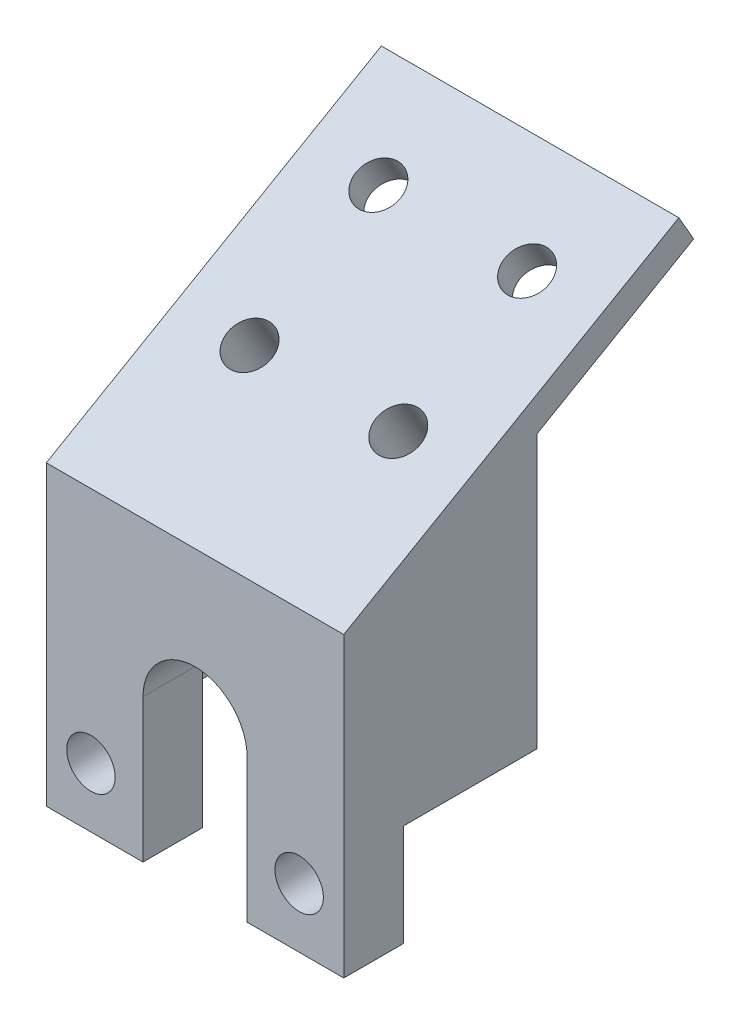
ISO-10303-21;
HEADER;
FILE_DESCRIPTION(('STEP AP214'),'2;1');
FILE_NAME('part.step','',(''),(''),'','','');
FILE_SCHEMA(('AUTOMOTIVE_DESIGN { 1 0 10303 214 1 1 1 1 }'));
ENDSEC;
DATA;
#1=APPLICATION_CONTEXT('core data for automotive mechanical design processes');
#2=APPLICATION_PROTOCOL_DEFINITION('international standard','automotive_design',2000,#1);
#3=PRODUCT_CONTEXT('',#1,'mechanical');
#4=PRODUCT('Part','Part','',(#3));
#5=PRODUCT_RELATED_PRODUCT_CATEGORY('part','',(#4));
#6=PRODUCT_DEFINITION_FORMATION('','',#4);
#7=PRODUCT_DEFINITION_CONTEXT('part definition',#1,'design');
#8=PRODUCT_DEFINITION('design','',#6,#7);
#9=PRODUCT_DEFINITION_SHAPE('','',#8);
#10=(LENGTH_UNIT() NAMED_UNIT(*) SI_UNIT(.MILLI.,.METRE.));
#11=(NAMED_UNIT(*) PLANE_ANGLE_UNIT() SI_UNIT($,.RADIAN.));
#12=(NAMED_UNIT(*) SI_UNIT($,.STERADIAN.) SOLID_ANGLE_UNIT());
#13=UNCERTAINTY_MEASURE_WITH_UNIT(LENGTH_MEASURE(1.E-05),#10,'distance_accuracy_value','');
#14=(GEOMETRIC_REPRESENTATION_CONTEXT(3) GLOBAL_UNCERTAINTY_ASSIGNED_CONTEXT((#13)) GLOBAL_UNIT_ASSIGNED_CONTEXT((#10,
#11,#12)) REPRESENTATION_CONTEXT('',''));
#15=CARTESIAN_POINT('',(0.,0.,0.));
#16=DIRECTION('',(0.,0.,1.));
#17=DIRECTION('',(1.,0.,0.));
#18=AXIS2_PLACEMENT_3D('',#15,#16,#17);
#19=CARTESIAN_POINT('',(-89.0344821648403,43.9136285796139,-9.));
#20=DIRECTION('',(0.,0.,1.));
#21=DIRECTION('',(1.,0.,0.));
#22=AXIS2_PLACEMENT_3D('',#19,#20,#21);
#23=PLANE('',#22);
#24=CARTESIAN_POINT('',(-81.0344821648403,43.1319750978219,-9.));
#25=DIRECTION('',(0.,0.,-1.));
#26=DIRECTION('',(-1.,0.,0.));
#27=AXIS2_PLACEMENT_3D('',#24,#25,#26);
#28=CIRCLE('',#27,0.999999999999998);
#29=CARTESIAN_POINT('',(-82.0344821648403,43.1319750978219,-9.));
#30=VERTEX_POINT('',#29);
#31=EDGE_CURVE('E163',#30,#30,#28,.T.);
#32=ORIENTED_EDGE('',*,*,#31,.F.);
#33=EDGE_LOOP('',(#32));
#34=FACE_BOUND('',#33,.T.);
#35=CARTESIAN_POINT('',(-96.5344821648403,51.7856142064587,-9.));
#36=DIRECTION('',(0.,0.,-1.));
#37=DIRECTION('',(-1.,0.,0.));
#38=AXIS2_PLACEMENT_3D('',#35,#36,#37);
#39=CIRCLE('',#38,0.999999999999998);
#40=CARTESIAN_POINT('',(-97.5344821648403,51.7856142064587,-9.));
#41=VERTEX_POINT('',#40);
#42=EDGE_CURVE('E169',#41,#41,#39,.T.);
#43=ORIENTED_EDGE('',*,*,#42,.F.);
#44=EDGE_LOOP('',(#43));
#45=FACE_BOUND('',#44,.T.);
#46=DIRECTION('',(-1.,0.,0.));
#47=VECTOR('',#46,1.);
#48=CARTESIAN_POINT('',(-79.0344821648403,59.4817666291652,-9.));
#49=LINE('',#48,#47);
#50=CARTESIAN_POINT('',(-79.0344821648403,59.4817666291652,-9.));
#51=VERTEX_POINT('',#50);
#52=CARTESIAN_POINT('',(-99.0344821648403,59.4817666291652,-9.));
#53=VERTEX_POINT('',#52);
#54=EDGE_CURVE('E152',#51,#53,#49,.T.);
#55=ORIENTED_EDGE('',*,*,#54,.F.);
#56=DIRECTION('',(0.,-1.,0.));
#57=VECTOR('',#56,1.);
#58=CARTESIAN_POINT('',(-79.0344821648403,41.1319750978219,-9.));
#59=LINE('',#58,#57);
#60=CARTESIAN_POINT('',(-79.0344821648403,41.1319750978219,-9.));
#61=VERTEX_POINT('',#60);
#62=EDGE_CURVE('E177',#51,#61,#59,.T.);
#63=ORIENTED_EDGE('',*,*,#62,.T.);
#64=DIRECTION('',(-1.,0.,0.));
#65=VECTOR('',#64,1.);
#66=CARTESIAN_POINT('',(-79.0344821648403,41.1319750978219,-9.));
#67=LINE('',#66,#65);
#68=CARTESIAN_POINT('',(-83.7182425250917,41.1319750978219,-9.));
#69=VERTEX_POINT('',#68);
#70=EDGE_CURVE('E179',#61,#69,#67,.T.);
#71=ORIENTED_EDGE('',*,*,#70,.T.);
#72=CARTESIAN_POINT('',(-89.0344821648403,43.9136285796139,-9.));
#73=DIRECTION('',(0.,0.,1.));
#74=DIRECTION('',(1.,0.,0.));
#75=AXIS2_PLACEMENT_3D('',#72,#73,#74);
#76=CIRCLE('',#75,6.);
#77=CARTESIAN_POINT('',(-94.3507218045889,41.1319750978219,-9.));
#78=VERTEX_POINT('',#77);
#79=EDGE_CURVE('E182',#69,#78,#76,.T.);
#80=ORIENTED_EDGE('',*,*,#79,.T.);
#81=DIRECTION('',(-1.,0.,0.));
#82=VECTOR('',#81,1.);
#83=CARTESIAN_POINT('',(-94.3507218045889,41.1319750978219,-9.));
#84=LINE('',#83,#82);
#85=CARTESIAN_POINT('',(-99.0344821648403,41.1319750978219,-9.));
#86=VERTEX_POINT('',#85);
#87=EDGE_CURVE('E184',#78,#86,#84,.T.);
#88=ORIENTED_EDGE('',*,*,#87,.T.);
#89=DIRECTION('',(0.,1.,0.));
#90=VECTOR('',#89,1.);
#91=CARTESIAN_POINT('',(-99.0344821648403,54.2856142064587,-9.));
#92=LINE('',#91,#90);
#93=EDGE_CURVE('E186',#86,#53,#92,.T.);
#94=ORIENTED_EDGE('',*,*,#93,.T.);
#95=EDGE_LOOP('',(#55,#63,#71,#80,#88,#94));
#96=FACE_BOUND('',#95,.T.);
#97=ADVANCED_FACE('F33',(#34,#45,#96),#23,.F.);
#98=CARTESIAN_POINT('',(-89.0344821648403,43.9136285796139,0.));
#99=DIRECTION('',(0.,0.,1.));
#100=DIRECTION('',(1.,0.,0.));
#101=AXIS2_PLACEMENT_3D('',#98,#99,#100);
#102=PLANE('',#101);
#103=CARTESIAN_POINT('',(-82.0344821648403,38.2856142064587,0.));
#104=DIRECTION('',(0.,0.,1.));
#105=DIRECTION('',(1.,0.,0.));
#106=AXIS2_PLACEMENT_3D('',#103,#104,#105);
#107=CIRCLE('',#106,1.62801437315523);
#108=CARTESIAN_POINT('',(-80.4064677916851,38.2856142064587,0.));
#109=VERTEX_POINT('',#108);
#110=EDGE_CURVE('E207',#109,#109,#107,.T.);
#111=ORIENTED_EDGE('',*,*,#110,.T.);
#112=EDGE_LOOP('',(#111));
#113=FACE_BOUND('',#112,.T.);
#114=CARTESIAN_POINT('',(-96.0344821648403,38.2856142064587,0.));
#115=DIRECTION('',(0.,0.,1.));
#116=DIRECTION('',(1.,0.,0.));
#117=AXIS2_PLACEMENT_3D('',#114,#115,#116);
#118=CIRCLE('',#117,1.62801437315523);
#119=CARTESIAN_POINT('',(-94.4064677916851,38.2856142064587,0.));
#120=VERTEX_POINT('',#119);
#121=EDGE_CURVE('E211',#120,#120,#118,.T.);
#122=ORIENTED_EDGE('',*,*,#121,.T.);
#123=EDGE_LOOP('',(#122));
#124=FACE_BOUND('',#123,.T.);
#125=DIRECTION('',(-1.,0.,0.));
#126=VECTOR('',#125,1.);
#127=CARTESIAN_POINT('',(-94.3507218045889,41.1319750978219,0.));
#128=LINE('',#127,#126);
#129=CARTESIAN_POINT('',(-94.3507218045889,41.1319750978219,0.));
#130=VERTEX_POINT('',#129);
#131=CARTESIAN_POINT('',(-99.0344821648403,41.1319750978219,0.));
#132=VERTEX_POINT('',#131);
#133=EDGE_CURVE('E180',#130,#132,#128,.T.);
#134=ORIENTED_EDGE('',*,*,#133,.F.);
#135=CARTESIAN_POINT('',(-89.0344821648403,43.9136285796139,0.));
#136=DIRECTION('',(0.,0.,1.));
#137=DIRECTION('',(1.,0.,0.));
#138=AXIS2_PLACEMENT_3D('',#135,#136,#137);
#139=CIRCLE('',#138,6.);
#140=CARTESIAN_POINT('',(-83.7182425250917,41.1319750978219,0.));
#141=VERTEX_POINT('',#140);
#142=EDGE_CURVE('E191',#141,#130,#139,.T.);
#143=ORIENTED_EDGE('',*,*,#142,.F.);
#144=DIRECTION('',(-1.,0.,0.));
#145=VECTOR('',#144,1.);
#146=CARTESIAN_POINT('',(-79.0344821648403,41.1319750978219,0.));
#147=LINE('',#146,#145);
#148=CARTESIAN_POINT('',(-79.0344821648403,41.1319750978219,0.));
#149=VERTEX_POINT('',#148);
#150=EDGE_CURVE('E168',#149,#141,#147,.T.);
#151=ORIENTED_EDGE('',*,*,#150,.F.);
#152=DIRECTION('',(0.,1.,0.));
#153=VECTOR('',#152,1.);
#154=CARTESIAN_POINT('',(-79.0344821648403,42.2856142064587,0.));
#155=LINE('',#154,#153);
#156=CARTESIAN_POINT('',(-79.0344821648403,34.2856142064587,0.));
#157=VERTEX_POINT('',#156);
#158=EDGE_CURVE('E223',#157,#149,#155,.T.);
#159=ORIENTED_EDGE('',*,*,#158,.F.);
#160=DIRECTION('',(1.,0.,0.));
#161=VECTOR('',#160,1.);
#162=CARTESIAN_POINT('',(-79.0344821648403,34.2856142064587,0.));
#163=LINE('',#162,#161);
#164=CARTESIAN_POINT('',(-85.5344821648403,34.2856142064587,0.));
#165=VERTEX_POINT('',#164);
#166=EDGE_CURVE('E249',#165,#157,#163,.T.);
#167=ORIENTED_EDGE('',*,*,#166,.F.);
#168=DIRECTION('',(0.,-1.,0.));
#169=VECTOR('',#168,1.);
#170=CARTESIAN_POINT('',(-85.5344821648403,34.2856142064587,0.));
#171=LINE('',#170,#169);
#172=CARTESIAN_POINT('',(-85.5344821648403,43.9136285796139,0.));
#173=VERTEX_POINT('',#172);
#174=EDGE_CURVE('E247',#173,#165,#171,.T.);
#175=ORIENTED_EDGE('',*,*,#174,.F.);
#176=CARTESIAN_POINT('',(-89.0344821648403,43.9136285796139,0.));
#177=DIRECTION('',(0.,0.,-1.));
#178=DIRECTION('',(1.,0.,0.));
#179=AXIS2_PLACEMENT_3D('',#176,#177,#178);
#180=CIRCLE('',#179,3.5);
#181=CARTESIAN_POINT('',(-92.5344821648403,43.9136285796139,0.));
#182=VERTEX_POINT('',#181);
#183=EDGE_CURVE('E245',#182,#173,#180,.T.);
#184=ORIENTED_EDGE('',*,*,#183,.F.);
#185=DIRECTION('',(0.,1.,0.));
#186=VECTOR('',#185,1.);
#187=CARTESIAN_POINT('',(-92.5344821648403,34.2856142064587,0.));
#188=LINE('',#187,#186);
#189=CARTESIAN_POINT('',(-92.5344821648403,34.2856142064587,0.));
#190=VERTEX_POINT('',#189);
#191=EDGE_CURVE('E243',#190,#182,#188,.T.);
#192=ORIENTED_EDGE('',*,*,#191,.F.);
#193=DIRECTION('',(1.,0.,0.));
#194=VECTOR('',#193,1.);
#195=CARTESIAN_POINT('',(-92.5344821648403,34.2856142064587,0.));
#196=LINE('',#195,#194);
#197=CARTESIAN_POINT('',(-99.0344821648403,34.2856142064587,0.));
#198=VERTEX_POINT('',#197);
#199=EDGE_CURVE('E241',#198,#190,#196,.T.);
#200=ORIENTED_EDGE('',*,*,#199,.F.);
#201=DIRECTION('',(0.,-1.,0.));
#202=VECTOR('',#201,1.);
#203=CARTESIAN_POINT('',(-99.0344821648403,34.2856142064587,0.));
#204=LINE('',#203,#202);
#205=EDGE_CURVE('E217',#132,#198,#204,.T.);
#206=ORIENTED_EDGE('',*,*,#205,.F.);
#207=EDGE_LOOP('',(#134,#143,#151,#159,#167,#175,#184,#192,#200,#206));
#208=FACE_BOUND('',#207,.T.);
#209=ADVANCED_FACE('F340',(#113,#124,#208),#102,.F.);
#210=CARTESIAN_POINT('',(-89.0344821648403,43.9136285796139,4.));
#211=DIRECTION('',(0.,0.,1.));
#212=DIRECTION('',(1.,0.,0.));
#213=AXIS2_PLACEMENT_3D('',#210,#211,#212);
#214=PLANE('',#213);
#215=CARTESIAN_POINT('',(-96.0344821648403,38.2856142064587,4.));
#216=DIRECTION('',(0.,0.,1.));
#217=DIRECTION('',(1.,0.,0.));
#218=AXIS2_PLACEMENT_3D('',#215,#216,#217);
#219=CIRCLE('',#218,1.62801437315523);
#220=CARTESIAN_POINT('',(-94.4064677916851,38.2856142064587,4.));
#221=VERTEX_POINT('',#220);
#222=EDGE_CURVE('E214',#221,#221,#219,.T.);
#223=ORIENTED_EDGE('',*,*,#222,.F.);
#224=EDGE_LOOP('',(#223));
#225=FACE_BOUND('',#224,.T.);
#226=DIRECTION('',(0.,-1.,0.));
#227=VECTOR('',#226,1.);
#228=CARTESIAN_POINT('',(-99.0344821648403,54.2856142064587,4.));
#229=LINE('',#228,#227);
#230=CARTESIAN_POINT('',(-99.0344821648403,54.2856142064587,4.));
#231=VERTEX_POINT('',#230);
#232=CARTESIAN_POINT('',(-99.0344821648403,34.2856142064587,4.));
#233=VERTEX_POINT('',#232);
#234=EDGE_CURVE('E220',#231,#233,#229,.T.);
#235=ORIENTED_EDGE('',*,*,#234,.T.);
#236=DIRECTION('',(1.,0.,0.));
#237=VECTOR('',#236,1.);
#238=CARTESIAN_POINT('',(-92.5344821648403,34.2856142064587,4.));
#239=LINE('',#238,#237);
#240=CARTESIAN_POINT('',(-92.5344821648403,34.2856142064587,4.));
#241=VERTEX_POINT('',#240);
#242=EDGE_CURVE('E222',#233,#241,#239,.T.);
#243=ORIENTED_EDGE('',*,*,#242,.T.);
#244=DIRECTION('',(0.,1.,0.));
#245=VECTOR('',#244,1.);
#246=CARTESIAN_POINT('',(-92.5344821648403,34.2856142064587,4.));
#247=LINE('',#246,#245);
#248=CARTESIAN_POINT('',(-92.5344821648403,43.9136285796139,4.));
#249=VERTEX_POINT('',#248);
#250=EDGE_CURVE('E225',#241,#249,#247,.T.);
#251=ORIENTED_EDGE('',*,*,#250,.T.);
#252=CARTESIAN_POINT('',(-89.0344821648403,43.9136285796139,4.));
#253=DIRECTION('',(0.,0.,-1.));
#254=DIRECTION('',(1.,0.,0.));
#255=AXIS2_PLACEMENT_3D('',#252,#253,#254);
#256=CIRCLE('',#255,3.5);
#257=CARTESIAN_POINT('',(-85.5344821648403,43.9136285796139,4.));
#258=VERTEX_POINT('',#257);
#259=EDGE_CURVE('E227',#249,#258,#256,.T.);
#260=ORIENTED_EDGE('',*,*,#259,.T.);
#261=DIRECTION('',(0.,-1.,0.));
#262=VECTOR('',#261,1.);
#263=CARTESIAN_POINT('',(-85.5344821648403,34.2856142064587,4.));
#264=LINE('',#263,#262);
#265=CARTESIAN_POINT('',(-85.5344821648403,34.2856142064587,4.));
#266=VERTEX_POINT('',#265);
#267=EDGE_CURVE('E229',#258,#266,#264,.T.);
#268=ORIENTED_EDGE('',*,*,#267,.T.);
#269=DIRECTION('',(1.,0.,0.));
#270=VECTOR('',#269,1.);
#271=CARTESIAN_POINT('',(-79.0344821648403,34.2856142064587,4.));
#272=LINE('',#271,#270);
#273=CARTESIAN_POINT('',(-79.0344821648403,34.2856142064587,4.));
#274=VERTEX_POINT('',#273);
#275=EDGE_CURVE('E231',#266,#274,#272,.T.);
#276=ORIENTED_EDGE('',*,*,#275,.T.);
#277=DIRECTION('',(0.,1.,0.));
#278=VECTOR('',#277,1.);
#279=CARTESIAN_POINT('',(-79.0344821648403,42.2856142064587,4.));
#280=LINE('',#279,#278);
#281=CARTESIAN_POINT('',(-79.0344821648403,54.2856142064587,4.));
#282=VERTEX_POINT('',#281);
#283=EDGE_CURVE('E233',#274,#282,#280,.T.);
#284=ORIENTED_EDGE('',*,*,#283,.T.);
#285=DIRECTION('',(-1.,0.,0.));
#286=VECTOR('',#285,1.);
#287=CARTESIAN_POINT('',(-79.0344821648403,54.2856142064587,4.));
#288=LINE('',#287,#286);
#289=EDGE_CURVE('E236',#282,#231,#288,.T.);
#290=ORIENTED_EDGE('',*,*,#289,.T.);
#291=EDGE_LOOP('',(#235,#243,#251,#260,#268,#276,#284,#290));
#292=FACE_BOUND('',#291,.T.);
#293=CARTESIAN_POINT('',(-82.0344821648403,38.2856142064587,4.));
#294=DIRECTION('',(0.,0.,1.));
#295=DIRECTION('',(1.,0.,0.));
#296=AXIS2_PLACEMENT_3D('',#293,#294,#295);
#297=CIRCLE('',#296,1.62801437315523);
#298=CARTESIAN_POINT('',(-80.4064677916851,38.2856142064587,4.));
#299=VERTEX_POINT('',#298);
#300=EDGE_CURVE('E208',#299,#299,#297,.T.);
#301=ORIENTED_EDGE('',*,*,#300,.F.);
#302=EDGE_LOOP('',(#301));
#303=FACE_BOUND('',#302,.T.);
#304=ADVANCED_FACE('F299',(#225,#292,#303),#214,.T.);
#305=CARTESIAN_POINT('',(-99.0344821648403,34.2856142064587,4.));
#306=DIRECTION('',(1.,0.,0.));
#307=DIRECTION('',(0.,0.,-1.));
#308=AXIS2_PLACEMENT_3D('',#305,#306,#307);
#309=PLANE('',#308);
#310=DIRECTION('',(0.,0.499999999999995,-0.866025403784442));
#311=VECTOR('',#310,1.);
#312=CARTESIAN_POINT('',(-99.0344821648403,61.7911677059237,-9.));
#313=LINE('',#312,#311);
#314=CARTESIAN_POINT('',(-99.0344821648403,67.2911677059237,-18.5262794416289));
#315=VERTEX_POINT('',#314);
#316=EDGE_CURVE('E148',#231,#315,#313,.T.);
#317=ORIENTED_EDGE('',*,*,#316,.T.);
#318=DIRECTION('',(0.,0.866025403784442,0.499999999999995));
#319=VECTOR('',#318,1.);
#320=CARTESIAN_POINT('',(-99.0344821648403,65.5591168983548,-19.5262794416288));
#321=LINE('',#320,#319);
#322=CARTESIAN_POINT('',(-99.0344821648403,65.5591168983548,-19.5262794416288));
#323=VERTEX_POINT('',#322);
#324=EDGE_CURVE('E137',#323,#315,#321,.T.);
#325=ORIENTED_EDGE('',*,*,#324,.F.);
#326=DIRECTION('',(0.,-0.500000000000001,0.866025403784438));
#327=VECTOR('',#326,1.);
#328=CARTESIAN_POINT('',(-99.0344821648403,67.5591168983548,-22.9903810567666));
#329=LINE('',#328,#327);
#330=EDGE_CURVE('E145',#323,#53,#329,.T.);
#331=ORIENTED_EDGE('',*,*,#330,.T.);
#332=ORIENTED_EDGE('',*,*,#93,.F.);
#333=DIRECTION('',(0.,0.,1.));
#334=VECTOR('',#333,1.);
#335=CARTESIAN_POINT('',(-99.0344821648403,41.1319750978219,-9.));
#336=LINE('',#335,#334);
#337=EDGE_CURVE('E188',#86,#132,#336,.T.);
#338=ORIENTED_EDGE('',*,*,#337,.T.);
#339=ORIENTED_EDGE('',*,*,#205,.T.);
#340=DIRECTION('',(0.,0.,-1.));
#341=VECTOR('',#340,1.);
#342=CARTESIAN_POINT('',(-99.0344821648403,34.2856142064587,4.));
#343=LINE('',#342,#341);
#344=EDGE_CURVE('E11',#233,#198,#343,.T.);
#345=ORIENTED_EDGE('',*,*,#344,.F.);
#346=ORIENTED_EDGE('',*,*,#234,.F.);
#347=EDGE_LOOP('',(#317,#325,#331,#332,#338,#339,#345,#346));
#348=FACE_BOUND('',#347,.T.);
#349=ADVANCED_FACE('F35',(#348),#309,.F.);
#350=CARTESIAN_POINT('',(-92.5344821648403,34.2856142064587,4.));
#351=DIRECTION('',(0.,1.,0.));
#352=DIRECTION('',(0.,0.,1.));
#353=AXIS2_PLACEMENT_3D('',#350,#351,#352);
#354=PLANE('',#353);
#355=ORIENTED_EDGE('',*,*,#199,.T.);
#356=DIRECTION('',(0.,0.,-1.));
#357=VECTOR('',#356,1.);
#358=CARTESIAN_POINT('',(-92.5344821648403,34.2856142064587,4.));
#359=LINE('',#358,#357);
#360=EDGE_CURVE('E42',#241,#190,#359,.T.);
#361=ORIENTED_EDGE('',*,*,#360,.F.);
#362=ORIENTED_EDGE('',*,*,#242,.F.);
#363=ORIENTED_EDGE('',*,*,#344,.T.);
#364=EDGE_LOOP('',(#355,#361,#362,#363));
#365=FACE_BOUND('',#364,.T.);
#366=ADVANCED_FACE('F306',(#365),#354,.F.);
#367=CARTESIAN_POINT('',(-92.5344821648403,34.2856142064587,4.));
#368=DIRECTION('',(-1.,0.,0.));
#369=DIRECTION('',(0.,0.,1.));
#370=AXIS2_PLACEMENT_3D('',#367,#368,#369);
#371=PLANE('',#370);
#372=ORIENTED_EDGE('',*,*,#191,.T.);
#373=DIRECTION('',(0.,0.,-1.));
#374=VECTOR('',#373,1.);
#375=CARTESIAN_POINT('',(-92.5344821648403,43.9136285796139,4.));
#376=LINE('',#375,#374);
#377=EDGE_CURVE('E262',#249,#182,#376,.T.);
#378=ORIENTED_EDGE('',*,*,#377,.F.);
#379=ORIENTED_EDGE('',*,*,#250,.F.);
#380=ORIENTED_EDGE('',*,*,#360,.T.);
#381=EDGE_LOOP('',(#372,#378,#379,#380));
#382=FACE_BOUND('',#381,.T.);
#383=ADVANCED_FACE('F312',(#382),#371,.F.);
#384=CARTESIAN_POINT('',(-89.0344821648403,43.9136285796139,4.));
#385=DIRECTION('',(0.,0.,-1.));
#386=DIRECTION('',(-1.,0.,0.));
#387=AXIS2_PLACEMENT_3D('',#384,#385,#386);
#388=CYLINDRICAL_SURFACE('',#387,3.5);
#389=ORIENTED_EDGE('',*,*,#183,.T.);
#390=DIRECTION('',(0.,0.,-1.));
#391=VECTOR('',#390,1.);
#392=CARTESIAN_POINT('',(-85.5344821648403,43.9136285796139,4.));
#393=LINE('',#392,#391);
#394=EDGE_CURVE('E259',#258,#173,#393,.T.);
#395=ORIENTED_EDGE('',*,*,#394,.F.);
#396=ORIENTED_EDGE('',*,*,#259,.F.);
#397=ORIENTED_EDGE('',*,*,#377,.T.);
#398=EDGE_LOOP('',(#389,#395,#396,#397));
#399=FACE_BOUND('',#398,.T.);
#400=ADVANCED_FACE('F316',(#399),#388,.F.);
#401=CARTESIAN_POINT('',(-85.5344821648403,34.2856142064587,4.));
#402=DIRECTION('',(1.,0.,0.));
#403=DIRECTION('',(0.,0.,-1.));
#404=AXIS2_PLACEMENT_3D('',#401,#402,#403);
#405=PLANE('',#404);
#406=ORIENTED_EDGE('',*,*,#174,.T.);
#407=DIRECTION('',(0.,0.,-1.));
#408=VECTOR('',#407,1.);
#409=CARTESIAN_POINT('',(-85.5344821648403,34.2856142064587,4.));
#410=LINE('',#409,#408);
#411=EDGE_CURVE('E256',#266,#165,#410,.T.);
#412=ORIENTED_EDGE('',*,*,#411,.F.);
#413=ORIENTED_EDGE('',*,*,#267,.F.);
#414=ORIENTED_EDGE('',*,*,#394,.T.);
#415=EDGE_LOOP('',(#406,#412,#413,#414));
#416=FACE_BOUND('',#415,.T.);
#417=ADVANCED_FACE('F321',(#416),#405,.F.);
#418=CARTESIAN_POINT('',(-79.0344821648403,34.2856142064587,4.));
#419=DIRECTION('',(0.,1.,0.));
#420=DIRECTION('',(0.,0.,1.));
#421=AXIS2_PLACEMENT_3D('',#418,#419,#420);
#422=PLANE('',#421);
#423=ORIENTED_EDGE('',*,*,#166,.T.);
#424=DIRECTION('',(0.,0.,-1.));
#425=VECTOR('',#424,1.);
#426=CARTESIAN_POINT('',(-79.0344821648403,34.2856142064587,4.));
#427=LINE('',#426,#425);
#428=EDGE_CURVE('E239',#274,#157,#427,.T.);
#429=ORIENTED_EDGE('',*,*,#428,.F.);
#430=ORIENTED_EDGE('',*,*,#275,.F.);
#431=ORIENTED_EDGE('',*,*,#411,.T.);
#432=EDGE_LOOP('',(#423,#429,#430,#431));
#433=FACE_BOUND('',#432,.T.);
#434=ADVANCED_FACE('F325',(#433),#422,.F.);
#435=CARTESIAN_POINT('',(-79.0344821648403,42.2856142064587,4.));
#436=DIRECTION('',(-1.,0.,0.));
#437=DIRECTION('',(0.,0.,1.));
#438=AXIS2_PLACEMENT_3D('',#435,#436,#437);
#439=PLANE('',#438);
#440=DIRECTION('',(0.,-0.500000000000001,0.866025403784438));
#441=VECTOR('',#440,1.);
#442=CARTESIAN_POINT('',(-79.0344821648403,67.5591168983548,-22.9903810567666));
#443=LINE('',#442,#441);
#444=CARTESIAN_POINT('',(-79.0344821648403,65.5591168983548,-19.5262794416288));
#445=VERTEX_POINT('',#444);
#446=EDGE_CURVE('E57',#445,#51,#443,.T.);
#447=ORIENTED_EDGE('',*,*,#446,.F.);
#448=DIRECTION('',(0.,0.866025403784442,0.499999999999995));
#449=VECTOR('',#448,1.);
#450=CARTESIAN_POINT('',(-79.0344821648403,65.5591168983548,-19.5262794416288));
#451=LINE('',#450,#449);
#452=CARTESIAN_POINT('',(-79.0344821648403,67.2911677059237,-18.5262794416289));
#453=VERTEX_POINT('',#452);
#454=EDGE_CURVE('E50',#445,#453,#451,.T.);
#455=ORIENTED_EDGE('',*,*,#454,.T.);
#456=DIRECTION('',(0.,0.499999999999995,-0.866025403784442));
#457=VECTOR('',#456,1.);
#458=CARTESIAN_POINT('',(-79.0344821648403,61.7911677059237,-9.));
#459=LINE('',#458,#457);
#460=EDGE_CURVE('E160',#282,#453,#459,.T.);
#461=ORIENTED_EDGE('',*,*,#460,.F.);
#462=ORIENTED_EDGE('',*,*,#283,.F.);
#463=ORIENTED_EDGE('',*,*,#428,.T.);
#464=ORIENTED_EDGE('',*,*,#158,.T.);
#465=DIRECTION('',(0.,0.,1.));
#466=VECTOR('',#465,1.);
#467=CARTESIAN_POINT('',(-79.0344821648403,41.1319750978219,-9.));
#468=LINE('',#467,#466);
#469=EDGE_CURVE('E204',#61,#149,#468,.T.);
#470=ORIENTED_EDGE('',*,*,#469,.F.);
#471=ORIENTED_EDGE('',*,*,#62,.F.);
#472=EDGE_LOOP('',(#447,#455,#461,#462,#463,#464,#470,#471));
#473=FACE_BOUND('',#472,.T.);
#474=ADVANCED_FACE('F293',(#473),#439,.F.);
#475=CARTESIAN_POINT('',(-96.0344821648403,38.2856142064587,4.));
#476=DIRECTION('',(0.,0.,-1.));
#477=DIRECTION('',(-1.,0.,0.));
#478=AXIS2_PLACEMENT_3D('',#475,#476,#477);
#479=CYLINDRICAL_SURFACE('',#478,1.62801437315523);
#480=ORIENTED_EDGE('',*,*,#222,.T.);
#481=EDGE_LOOP('',(#480));
#482=FACE_BOUND('',#481,.T.);
#483=ORIENTED_EDGE('',*,*,#121,.F.);
#484=EDGE_LOOP('',(#483));
#485=FACE_BOUND('',#484,.T.);
#486=ADVANCED_FACE('F491',(#482,#485),#479,.F.);
#487=CARTESIAN_POINT('',(-82.0344821648403,38.2856142064587,4.));
#488=DIRECTION('',(0.,0.,-1.));
#489=DIRECTION('',(-1.,0.,0.));
#490=AXIS2_PLACEMENT_3D('',#487,#488,#489);
#491=CYLINDRICAL_SURFACE('',#490,1.62801437315523);
#492=ORIENTED_EDGE('',*,*,#300,.T.);
#493=EDGE_LOOP('',(#492));
#494=FACE_BOUND('',#493,.T.);
#495=ORIENTED_EDGE('',*,*,#110,.F.);
#496=EDGE_LOOP('',(#495));
#497=FACE_BOUND('',#496,.T.);
#498=ADVANCED_FACE('F351',(#494,#497),#491,.F.);
#499=CARTESIAN_POINT('',(-79.0344821648403,41.1319750978219,-9.));
#500=DIRECTION('',(0.,1.,0.));
#501=DIRECTION('',(0.,0.,1.));
#502=AXIS2_PLACEMENT_3D('',#499,#500,#501);
#503=PLANE('',#502);
#504=ORIENTED_EDGE('',*,*,#150,.T.);
#505=DIRECTION('',(0.,0.,1.));
#506=VECTOR('',#505,1.);
#507=CARTESIAN_POINT('',(-83.7182425250917,41.1319750978219,-9.));
#508=LINE('',#507,#506);
#509=EDGE_CURVE('E201',#69,#141,#508,.T.);
#510=ORIENTED_EDGE('',*,*,#509,.F.);
#511=ORIENTED_EDGE('',*,*,#70,.F.);
#512=ORIENTED_EDGE('',*,*,#469,.T.);
#513=EDGE_LOOP('',(#504,#510,#511,#512));
#514=FACE_BOUND('',#513,.T.);
#515=ADVANCED_FACE('F331',(#514),#503,.F.);
#516=CARTESIAN_POINT('',(-89.0344821648403,43.9136285796139,-9.));
#517=DIRECTION('',(0.,0.,1.));
#518=DIRECTION('',(1.,0.,0.));
#519=AXIS2_PLACEMENT_3D('',#516,#517,#518);
#520=CYLINDRICAL_SURFACE('',#519,6.);
#521=ORIENTED_EDGE('',*,*,#142,.T.);
#522=DIRECTION('',(0.,0.,1.));
#523=VECTOR('',#522,1.);
#524=CARTESIAN_POINT('',(-94.3507218045889,41.1319750978219,-9.));
#525=LINE('',#524,#523);
#526=EDGE_CURVE('E198',#78,#130,#525,.T.);
#527=ORIENTED_EDGE('',*,*,#526,.F.);
#528=ORIENTED_EDGE('',*,*,#79,.F.);
#529=ORIENTED_EDGE('',*,*,#509,.T.);
#530=EDGE_LOOP('',(#521,#527,#528,#529));
#531=FACE_BOUND('',#530,.T.);
#532=ADVANCED_FACE('F342',(#531),#520,.F.);
#533=CARTESIAN_POINT('',(-94.3507218045889,41.1319750978219,-9.));
#534=DIRECTION('',(0.,1.,0.));
#535=DIRECTION('',(0.,0.,1.));
#536=AXIS2_PLACEMENT_3D('',#533,#534,#535);
#537=PLANE('',#536);
#538=ORIENTED_EDGE('',*,*,#133,.T.);
#539=ORIENTED_EDGE('',*,*,#337,.F.);
#540=ORIENTED_EDGE('',*,*,#87,.F.);
#541=ORIENTED_EDGE('',*,*,#526,.T.);
#542=EDGE_LOOP('',(#538,#539,#540,#541));
#543=FACE_BOUND('',#542,.T.);
#544=ADVANCED_FACE('F339',(#543),#537,.F.);
#545=CARTESIAN_POINT('',(-81.0344821648403,43.1319750978219,-5.));
#546=DIRECTION('',(0.,0.,-1.));
#547=DIRECTION('',(-1.,0.,0.));
#548=AXIS2_PLACEMENT_3D('',#545,#546,#547);
#549=CYLINDRICAL_SURFACE('',#548,0.999999999999998);
#550=CARTESIAN_POINT('',(-81.0344821648403,43.1319750978219,-5.));
#551=DIRECTION('',(0.,0.,-1.));
#552=DIRECTION('',(-1.,0.,0.));
#553=AXIS2_PLACEMENT_3D('',#550,#551,#552);
#554=CIRCLE('',#553,0.999999999999998);
#555=CARTESIAN_POINT('',(-82.0344821648403,43.1319750978219,-5.));
#556=VERTEX_POINT('',#555);
#557=EDGE_CURVE('E172',#556,#556,#554,.T.);
#558=ORIENTED_EDGE('',*,*,#557,.F.);
#559=EDGE_LOOP('',(#558));
#560=FACE_BOUND('',#559,.T.);
#561=ORIENTED_EDGE('',*,*,#31,.T.);
#562=EDGE_LOOP('',(#561));
#563=FACE_BOUND('',#562,.T.);
#564=ADVANCED_FACE('F349',(#560,#563),#549,.F.);
#565=CARTESIAN_POINT('',(-81.0344821648403,43.1319750978219,-5.));
#566=DIRECTION('',(0.,0.,-1.));
#567=DIRECTION('',(-1.,0.,0.));
#568=AXIS2_PLACEMENT_3D('',#565,#566,#567);
#569=PLANE('',#568);
#570=ORIENTED_EDGE('',*,*,#557,.T.);
#571=EDGE_LOOP('',(#570));
#572=FACE_BOUND('',#571,.T.);
#573=ADVANCED_FACE('F366',(#572),#569,.T.);
#574=CARTESIAN_POINT('',(-96.5344821648403,51.7856142064587,-5.));
#575=DIRECTION('',(0.,0.,-1.));
#576=DIRECTION('',(-1.,0.,0.));
#577=AXIS2_PLACEMENT_3D('',#574,#575,#576);
#578=CYLINDRICAL_SURFACE('',#577,0.999999999999998);
#579=CARTESIAN_POINT('',(-96.5344821648403,51.7856142064587,-5.));
#580=DIRECTION('',(0.,0.,-1.));
#581=DIRECTION('',(-1.,0.,0.));
#582=AXIS2_PLACEMENT_3D('',#579,#580,#581);
#583=CIRCLE('',#582,0.999999999999998);
#584=CARTESIAN_POINT('',(-97.5344821648403,51.7856142064587,-5.));
#585=VERTEX_POINT('',#584);
#586=EDGE_CURVE('E165',#585,#585,#583,.T.);
#587=ORIENTED_EDGE('',*,*,#586,.F.);
#588=EDGE_LOOP('',(#587));
#589=FACE_BOUND('',#588,.T.);
#590=ORIENTED_EDGE('',*,*,#42,.T.);
#591=EDGE_LOOP('',(#590));
#592=FACE_BOUND('',#591,.T.);
#593=ADVANCED_FACE('F370',(#589,#592),#578,.F.);
#594=CARTESIAN_POINT('',(-96.5344821648403,51.7856142064587,-5.));
#595=DIRECTION('',(0.,0.,-1.));
#596=DIRECTION('',(-1.,0.,0.));
#597=AXIS2_PLACEMENT_3D('',#594,#595,#596);
#598=PLANE('',#597);
#599=ORIENTED_EDGE('',*,*,#586,.T.);
#600=EDGE_LOOP('',(#599));
#601=FACE_BOUND('',#600,.T.);
#602=ADVANCED_FACE('F374',(#601),#598,.T.);
#603=CARTESIAN_POINT('',(-79.0344821648403,61.7911677059237,-9.));
#604=DIRECTION('',(0.,0.866025403784442,0.499999999999995));
#605=DIRECTION('',(0.,-0.499999999999995,0.866025403784442));
#606=AXIS2_PLACEMENT_3D('',#603,#604,#605);
#607=PLANE('',#606);
#608=DIRECTION('',(1.,0.,0.));
#609=VECTOR('',#608,1.);
#610=CARTESIAN_POINT('',(-99.0344821648403,67.2911677059237,-18.5262794416289));
#611=LINE('',#610,#609);
#612=EDGE_CURVE('E140',#315,#453,#611,.T.);
#613=ORIENTED_EDGE('',*,*,#612,.F.);
#614=ORIENTED_EDGE('',*,*,#316,.F.);
#615=ORIENTED_EDGE('',*,*,#289,.F.);
#616=ORIENTED_EDGE('',*,*,#460,.T.);
#617=EDGE_LOOP('',(#613,#614,#615,#616));
#618=FACE_BOUND('',#617,.T.);
#619=CARTESIAN_POINT('',(-84.0344821648403,64.2883909561912,-13.3253175473055));
#620=DIRECTION('',(0.,0.866025403784442,0.499999999999995));
#621=DIRECTION('',(0.,-0.499999999999995,0.866025403784442));
#622=AXIS2_PLACEMENT_3D('',#619,#620,#621);
#623=CIRCLE('',#622,1.5);
#624=CARTESIAN_POINT('',(-84.0344821648403,63.5383909561912,-12.0262794416289));
#625=VERTEX_POINT('',#624);
#626=EDGE_CURVE('E278',#625,#625,#623,.T.);
#627=ORIENTED_EDGE('',*,*,#626,.F.);
#628=EDGE_LOOP('',(#627));
#629=FACE_BOUND('',#628,.T.);
#630=CARTESIAN_POINT('',(-94.0344821648403,64.2883909561911,-13.3253175473055));
#631=DIRECTION('',(0.,0.866025403784442,0.499999999999995));
#632=DIRECTION('',(0.,-0.499999999999995,0.866025403784442));
#633=AXIS2_PLACEMENT_3D('',#630,#631,#632);
#634=CIRCLE('',#633,1.5);
#635=CARTESIAN_POINT('',(-94.0344821648403,63.5383909561911,-12.0262794416288));
#636=VERTEX_POINT('',#635);
#637=EDGE_CURVE('E281',#636,#636,#634,.T.);
#638=ORIENTED_EDGE('',*,*,#637,.F.);
#639=EDGE_LOOP('',(#638));
#640=FACE_BOUND('',#639,.T.);
#641=CARTESIAN_POINT('',(-94.0344821648403,59.2883909561912,-4.66506350946105));
#642=DIRECTION('',(0.,0.866025403784442,0.499999999999995));
#643=DIRECTION('',(0.,-0.499999999999995,0.866025403784442));
#644=AXIS2_PLACEMENT_3D('',#641,#642,#643);
#645=CIRCLE('',#644,1.5);
#646=CARTESIAN_POINT('',(-94.0344821648403,58.5383909561912,-3.36602540378439));
#647=VERTEX_POINT('',#646);
#648=EDGE_CURVE('E284',#647,#647,#645,.T.);
#649=ORIENTED_EDGE('',*,*,#648,.F.);
#650=EDGE_LOOP('',(#649));
#651=FACE_BOUND('',#650,.T.);
#652=CARTESIAN_POINT('',(-84.0344821648403,59.2883909561912,-4.66506350946111));
#653=DIRECTION('',(0.,0.866025403784442,0.499999999999995));
#654=DIRECTION('',(0.,-0.499999999999995,0.866025403784442));
#655=AXIS2_PLACEMENT_3D('',#652,#653,#654);
#656=CIRCLE('',#655,1.5);
#657=CARTESIAN_POINT('',(-84.0344821648403,58.5383909561912,-3.36602540378445));
#658=VERTEX_POINT('',#657);
#659=EDGE_CURVE('E271',#658,#658,#656,.T.);
#660=ORIENTED_EDGE('',*,*,#659,.F.);
#661=EDGE_LOOP('',(#660));
#662=FACE_BOUND('',#661,.T.);
#663=ADVANCED_FACE('F296',(#618,#629,#640,#651,#662),#607,.T.);
#664=CARTESIAN_POINT('',(-79.0344821648403,67.5591168983548,-22.9903810567666));
#665=DIRECTION('',(0.,-0.866025403784438,-0.500000000000001));
#666=DIRECTION('',(0.,0.500000000000001,-0.866025403784438));
#667=AXIS2_PLACEMENT_3D('',#664,#665,#666);
#668=PLANE('',#667);
#669=DIRECTION('',(1.,0.,0.));
#670=VECTOR('',#669,1.);
#671=CARTESIAN_POINT('',(-99.0344821648403,65.5591168983548,-19.5262794416288));
#672=LINE('',#671,#670);
#673=EDGE_CURVE('E134',#323,#445,#672,.T.);
#674=ORIENTED_EDGE('',*,*,#673,.T.);
#675=ORIENTED_EDGE('',*,*,#446,.T.);
#676=ORIENTED_EDGE('',*,*,#54,.T.);
#677=ORIENTED_EDGE('',*,*,#330,.F.);
#678=EDGE_LOOP('',(#674,#675,#676,#677));
#679=FACE_BOUND('',#678,.T.);
#680=CARTESIAN_POINT('',(-84.0344821648403,62.5563401486223,-14.3253175473055));
#681=DIRECTION('',(0.,-0.866025403784438,-0.500000000000001));
#682=DIRECTION('',(0.,0.500000000000001,-0.866025403784438));
#683=AXIS2_PLACEMENT_3D('',#680,#681,#682);
#684=CIRCLE('',#683,1.5);
#685=CARTESIAN_POINT('',(-84.0344821648403,63.3063401486223,-15.6243556529822));
#686=VERTEX_POINT('',#685);
#687=EDGE_CURVE('E37',#686,#686,#684,.T.);
#688=ORIENTED_EDGE('',*,*,#687,.F.);
#689=EDGE_LOOP('',(#688));
#690=FACE_BOUND('',#689,.T.);
#691=CARTESIAN_POINT('',(-94.0344821648403,62.5563401486222,-14.3253175473055));
#692=DIRECTION('',(0.,-0.866025403784438,-0.500000000000001));
#693=DIRECTION('',(0.,0.500000000000001,-0.866025403784438));
#694=AXIS2_PLACEMENT_3D('',#691,#692,#693);
#695=CIRCLE('',#694,1.5);
#696=CARTESIAN_POINT('',(-94.0344821648403,63.3063401486222,-15.6243556529821));
#697=VERTEX_POINT('',#696);
#698=EDGE_CURVE('E156',#697,#697,#695,.T.);
#699=ORIENTED_EDGE('',*,*,#698,.F.);
#700=EDGE_LOOP('',(#699));
#701=FACE_BOUND('',#700,.T.);
#702=ADVANCED_FACE('F150',(#679,#690,#701),#668,.T.);
#703=CARTESIAN_POINT('',(-94.0344821648403,60.8242893410534,-15.3253175473054));
#704=DIRECTION('',(0.,0.866025403784442,0.499999999999995));
#705=DIRECTION('',(0.,-0.499999999999995,0.866025403784442));
#706=AXIS2_PLACEMENT_3D('',#703,#704,#705);
#707=CYLINDRICAL_SURFACE('',#706,1.5);
#708=ORIENTED_EDGE('',*,*,#698,.T.);
#709=EDGE_LOOP('',(#708));
#710=FACE_BOUND('',#709,.T.);
#711=ORIENTED_EDGE('',*,*,#637,.T.);
#712=EDGE_LOOP('',(#711));
#713=FACE_BOUND('',#712,.T.);
#714=ADVANCED_FACE('F383',(#710,#713),#707,.F.);
#715=CARTESIAN_POINT('',(-84.0344821648403,60.8242893410534,-15.3253175473055));
#716=DIRECTION('',(0.,0.866025403784442,0.499999999999995));
#717=DIRECTION('',(0.,-0.499999999999995,0.866025403784442));
#718=AXIS2_PLACEMENT_3D('',#715,#716,#717);
#719=CYLINDRICAL_SURFACE('',#718,1.5);
#720=ORIENTED_EDGE('',*,*,#687,.T.);
#721=EDGE_LOOP('',(#720));
#722=FACE_BOUND('',#721,.T.);
#723=ORIENTED_EDGE('',*,*,#626,.T.);
#724=EDGE_LOOP('',(#723));
#725=FACE_BOUND('',#724,.T.);
#726=ADVANCED_FACE('F388',(#722,#725),#719,.F.);
#727=CARTESIAN_POINT('',(-84.0344821648403,55.8242893410534,-6.66506350946109));
#728=DIRECTION('',(0.,0.866025403784442,0.499999999999995));
#729=DIRECTION('',(0.,-0.499999999999995,0.866025403784442));
#730=AXIS2_PLACEMENT_3D('',#727,#728,#729);
#731=CYLINDRICAL_SURFACE('',#730,1.5);
#732=CARTESIAN_POINT('',(-84.0344821648403,55.8242893410534,-6.66506350946109));
#733=DIRECTION('',(0.,0.866025403784442,0.499999999999995));
#734=DIRECTION('',(0.,-0.499999999999995,0.866025403784442));
#735=AXIS2_PLACEMENT_3D('',#732,#733,#734);
#736=CIRCLE('',#735,1.5);
#737=CARTESIAN_POINT('',(-84.0344821648403,55.0742893410534,-5.36602540378443));
#738=VERTEX_POINT('',#737);
#739=EDGE_CURVE('E267',#738,#738,#736,.T.);
#740=ORIENTED_EDGE('',*,*,#739,.F.);
#741=EDGE_LOOP('',(#740));
#742=FACE_BOUND('',#741,.T.);
#743=ORIENTED_EDGE('',*,*,#659,.T.);
#744=EDGE_LOOP('',(#743));
#745=FACE_BOUND('',#744,.T.);
#746=ADVANCED_FACE('F384',(#742,#745),#731,.F.);
#747=CARTESIAN_POINT('',(-84.0344821648403,55.8242893410534,-6.66506350946109));
#748=DIRECTION('',(0.,0.866025403784442,0.499999999999995));
#749=DIRECTION('',(0.,-0.499999999999995,0.866025403784442));
#750=AXIS2_PLACEMENT_3D('',#747,#748,#749);
#751=PLANE('',#750);
#752=ORIENTED_EDGE('',*,*,#739,.T.);
#753=EDGE_LOOP('',(#752));
#754=FACE_BOUND('',#753,.T.);
#755=ADVANCED_FACE('F387',(#754),#751,.T.);
#756=CARTESIAN_POINT('',(-94.0344821648403,55.8242893410534,-6.66506350946103));
#757=DIRECTION('',(0.,0.866025403784442,0.499999999999995));
#758=DIRECTION('',(0.,-0.499999999999995,0.866025403784442));
#759=AXIS2_PLACEMENT_3D('',#756,#757,#758);
#760=CYLINDRICAL_SURFACE('',#759,1.5);
#761=CARTESIAN_POINT('',(-94.0344821648403,55.8242893410534,-6.66506350946103));
#762=DIRECTION('',(0.,0.866025403784442,0.499999999999995));
#763=DIRECTION('',(0.,-0.499999999999995,0.866025403784442));
#764=AXIS2_PLACEMENT_3D('',#761,#762,#763);
#765=CIRCLE('',#764,1.5);
#766=CARTESIAN_POINT('',(-94.0344821648403,55.0742893410534,-5.36602540378437));
#767=VERTEX_POINT('',#766);
#768=EDGE_CURVE('E276',#767,#767,#765,.T.);
#769=ORIENTED_EDGE('',*,*,#768,.F.);
#770=EDGE_LOOP('',(#769));
#771=FACE_BOUND('',#770,.T.);
#772=ORIENTED_EDGE('',*,*,#648,.T.);
#773=EDGE_LOOP('',(#772));
#774=FACE_BOUND('',#773,.T.);
#775=ADVANCED_FACE('F392',(#771,#774),#760,.F.);
#776=CARTESIAN_POINT('',(-94.0344821648403,55.8242893410534,-6.66506350946103));
#777=DIRECTION('',(0.,0.866025403784442,0.499999999999995));
#778=DIRECTION('',(0.,-0.499999999999995,0.866025403784442));
#779=AXIS2_PLACEMENT_3D('',#776,#777,#778);
#780=PLANE('',#779);
#781=ORIENTED_EDGE('',*,*,#768,.T.);
#782=EDGE_LOOP('',(#781));
#783=FACE_BOUND('',#782,.T.);
#784=ADVANCED_FACE('F400',(#783),#780,.T.);
#785=CARTESIAN_POINT('',(-99.0344821648403,65.5591168983548,-19.5262794416288));
#786=DIRECTION('',(0.,-0.499999999999995,0.866025403784442));
#787=DIRECTION('',(0.,-0.866025403784442,-0.499999999999995));
#788=AXIS2_PLACEMENT_3D('',#785,#786,#787);
#789=PLANE('',#788);
#790=ORIENTED_EDGE('',*,*,#612,.T.);
#791=ORIENTED_EDGE('',*,*,#454,.F.);
#792=ORIENTED_EDGE('',*,*,#673,.F.);
#793=ORIENTED_EDGE('',*,*,#324,.T.);
#794=EDGE_LOOP('',(#790,#791,#792,#793));
#795=FACE_BOUND('',#794,.T.);
#796=ADVANCED_FACE('F136',(#795),#789,.F.);
#797=CLOSED_SHELL('',(#97,#209,#304,#349,#366,#383,#400,#417,#434,#474,#486,#498,#515,#532,#544,
#564,#573,#593,#602,#663,#702,#714,#726,#746,#755,#775,#784,#796));
#798=MANIFOLD_SOLID_BREP('B2',#797);
#799=ADVANCED_BREP_SHAPE_REPRESENTATION('',(#18,#798),#14);
#800=SHAPE_DEFINITION_REPRESENTATION(#9,#799);
ENDSEC;
END-ISO-10303-21;
